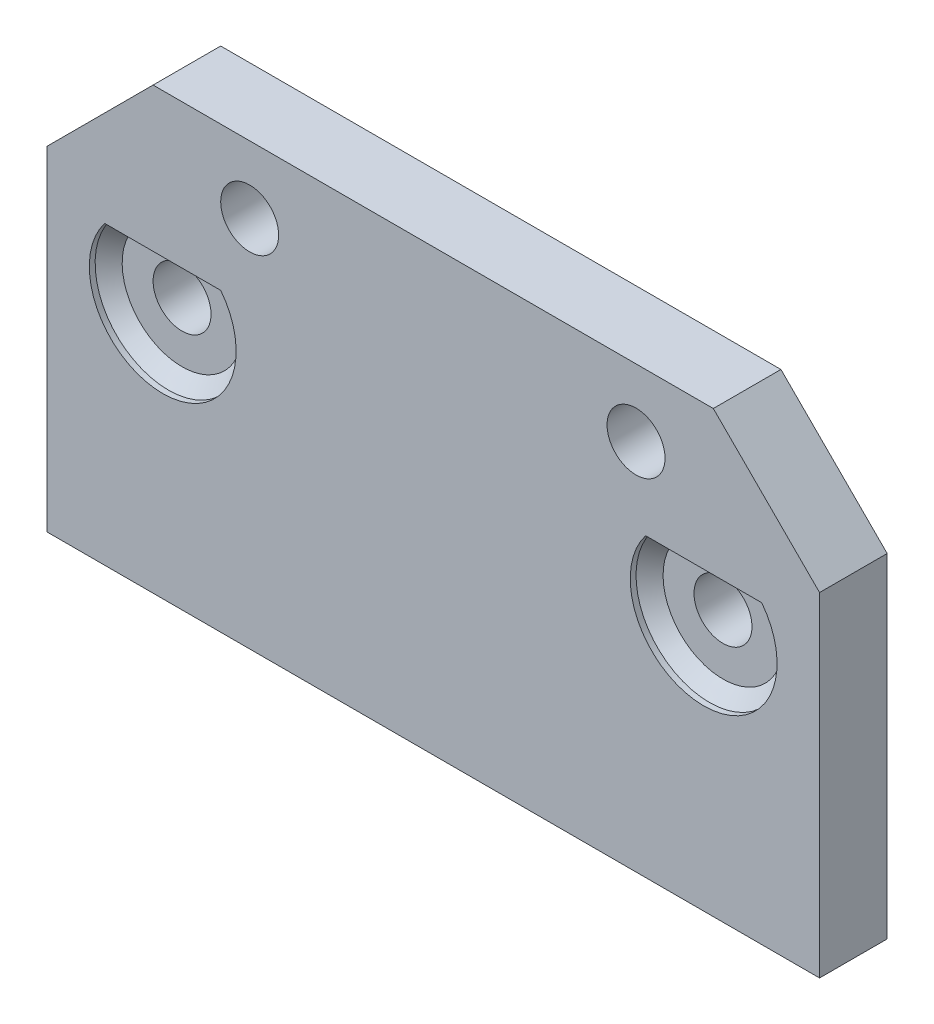
ISO-10303-21;
HEADER;
FILE_DESCRIPTION(('STEP AP214'),'2;1');
FILE_NAME('part.step','',(''),(''),'','','');
FILE_SCHEMA(('AUTOMOTIVE_DESIGN { 1 0 10303 214 1 1 1 1 }'));
ENDSEC;
DATA;
#1=APPLICATION_CONTEXT('core data for automotive mechanical design processes');
#2=APPLICATION_PROTOCOL_DEFINITION('international standard','automotive_design',2000,#1);
#3=PRODUCT_CONTEXT('',#1,'mechanical');
#4=PRODUCT('Part','Part','',(#3));
#5=PRODUCT_RELATED_PRODUCT_CATEGORY('part','',(#4));
#6=PRODUCT_DEFINITION_FORMATION('','',#4);
#7=PRODUCT_DEFINITION_CONTEXT('part definition',#1,'design');
#8=PRODUCT_DEFINITION('design','',#6,#7);
#9=PRODUCT_DEFINITION_SHAPE('','',#8);
#10=(LENGTH_UNIT() NAMED_UNIT(*) SI_UNIT(.MILLI.,.METRE.));
#11=(NAMED_UNIT(*) PLANE_ANGLE_UNIT() SI_UNIT($,.RADIAN.));
#12=(NAMED_UNIT(*) SI_UNIT($,.STERADIAN.) SOLID_ANGLE_UNIT());
#13=UNCERTAINTY_MEASURE_WITH_UNIT(LENGTH_MEASURE(1.E-05),#10,'distance_accuracy_value','');
#14=(GEOMETRIC_REPRESENTATION_CONTEXT(3) GLOBAL_UNCERTAINTY_ASSIGNED_CONTEXT((#13)) GLOBAL_UNIT_ASSIGNED_CONTEXT((#10,
#11,#12)) REPRESENTATION_CONTEXT('',''));
#15=CARTESIAN_POINT('',(0.,0.,0.));
#16=DIRECTION('',(0.,0.,1.));
#17=DIRECTION('',(1.,0.,0.));
#18=AXIS2_PLACEMENT_3D('',#15,#16,#17);
#19=CARTESIAN_POINT('',(21.1621621621622,3.,-2.5));
#20=DIRECTION('',(0.,0.,1.));
#21=DIRECTION('',(1.,0.,0.));
#22=AXIS2_PLACEMENT_3D('',#19,#20,#21);
#23=CYLINDRICAL_SURFACE('',#22,1.5);
#24=CARTESIAN_POINT('',(21.1621621621622,3.,-2.5));
#25=DIRECTION('',(0.,0.,1.));
#26=DIRECTION('',(1.,0.,0.));
#27=AXIS2_PLACEMENT_3D('',#24,#25,#26);
#28=CIRCLE('',#27,1.5);
#29=CARTESIAN_POINT('',(22.6621621621622,3.,-2.5));
#30=VERTEX_POINT('',#29);
#31=EDGE_CURVE('E278',#30,#30,#28,.T.);
#32=ORIENTED_EDGE('',*,*,#31,.F.);
#33=EDGE_LOOP('',(#32));
#34=FACE_BOUND('',#33,.T.);
#35=CARTESIAN_POINT('',(21.1621621621622,3.,0.));
#36=DIRECTION('',(0.,0.,1.));
#37=DIRECTION('',(1.,0.,0.));
#38=AXIS2_PLACEMENT_3D('',#35,#36,#37);
#39=CIRCLE('',#38,1.5);
#40=CARTESIAN_POINT('',(22.6621621621622,3.,0.));
#41=VERTEX_POINT('',#40);
#42=EDGE_CURVE('E264',#41,#41,#39,.F.);
#43=ORIENTED_EDGE('',*,*,#42,.F.);
#44=EDGE_LOOP('',(#43));
#45=FACE_BOUND('',#44,.T.);
#46=ADVANCED_FACE('F37',(#34,#45),#23,.F.);
#47=CARTESIAN_POINT('',(-6.83783783783783,3.,-2.5));
#48=DIRECTION('',(0.,0.,1.));
#49=DIRECTION('',(1.,0.,0.));
#50=AXIS2_PLACEMENT_3D('',#47,#48,#49);
#51=CYLINDRICAL_SURFACE('',#50,1.5);
#52=CARTESIAN_POINT('',(-6.83783783783783,3.,-2.5));
#53=DIRECTION('',(0.,0.,1.));
#54=DIRECTION('',(1.,0.,0.));
#55=AXIS2_PLACEMENT_3D('',#52,#53,#54);
#56=CIRCLE('',#55,1.5);
#57=CARTESIAN_POINT('',(-5.33783783783783,3.,-2.5));
#58=VERTEX_POINT('',#57);
#59=EDGE_CURVE('E286',#58,#58,#56,.T.);
#60=ORIENTED_EDGE('',*,*,#59,.F.);
#61=EDGE_LOOP('',(#60));
#62=FACE_BOUND('',#61,.T.);
#63=CARTESIAN_POINT('',(-6.83783783783783,3.,0.));
#64=DIRECTION('',(0.,0.,1.));
#65=DIRECTION('',(1.,0.,0.));
#66=AXIS2_PLACEMENT_3D('',#63,#64,#65);
#67=CIRCLE('',#66,1.5);
#68=CARTESIAN_POINT('',(-5.33783783783783,3.,0.));
#69=VERTEX_POINT('',#68);
#70=EDGE_CURVE('E268',#69,#69,#67,.F.);
#71=ORIENTED_EDGE('',*,*,#70,.F.);
#72=EDGE_LOOP('',(#71));
#73=FACE_BOUND('',#72,.T.);
#74=ADVANCED_FACE('F354',(#62,#73),#51,.F.);
#75=CARTESIAN_POINT('',(-12.8378378378378,18.5,-2.5));
#76=DIRECTION('',(1.,0.,0.));
#77=DIRECTION('',(0.,0.,-1.));
#78=AXIS2_PLACEMENT_3D('',#75,#76,#77);
#79=PLANE('',#78);
#80=DIRECTION('',(0.,-1.,0.));
#81=VECTOR('',#80,1.);
#82=CARTESIAN_POINT('',(-12.8378378378378,18.5,-2.5));
#83=LINE('',#82,#81);
#84=CARTESIAN_POINT('',(-12.8378378378378,7.28013422091094,-2.5));
#85=VERTEX_POINT('',#84);
#86=CARTESIAN_POINT('',(-12.8378378378378,-10.,-2.5));
#87=VERTEX_POINT('',#86);
#88=EDGE_CURVE('E284',#85,#87,#83,.T.);
#89=ORIENTED_EDGE('',*,*,#88,.T.);
#90=DIRECTION('',(0.,0.,-1.));
#91=VECTOR('',#90,1.);
#92=CARTESIAN_POINT('',(-12.8378378378378,-10.,1.));
#93=LINE('',#92,#91);
#94=CARTESIAN_POINT('',(-12.8378378378378,-10.,1.));
#95=VERTEX_POINT('',#94);
#96=EDGE_CURVE('E179',#95,#87,#93,.T.);
#97=ORIENTED_EDGE('',*,*,#96,.F.);
#98=DIRECTION('',(0.,-1.,0.));
#99=VECTOR('',#98,1.);
#100=CARTESIAN_POINT('',(-12.8378378378378,12.7801342209109,1.));
#101=LINE('',#100,#99);
#102=CARTESIAN_POINT('',(-12.8378378378378,7.28013422091094,1.));
#103=VERTEX_POINT('',#102);
#104=EDGE_CURVE('E295',#103,#95,#101,.T.);
#105=ORIENTED_EDGE('',*,*,#104,.F.);
#106=DIRECTION('',(0.,0.,1.));
#107=VECTOR('',#106,1.);
#108=CARTESIAN_POINT('',(-12.8378378378378,7.28013422091094,-2.5));
#109=LINE('',#108,#107);
#110=EDGE_CURVE('E324',#85,#103,#109,.T.);
#111=ORIENTED_EDGE('',*,*,#110,.F.);
#112=EDGE_LOOP('',(#89,#97,#105,#111));
#113=FACE_BOUND('',#112,.T.);
#114=ADVANCED_FACE('F360',(#113),#79,.F.);
#115=CARTESIAN_POINT('',(27.1621621621622,18.5,-2.5));
#116=DIRECTION('',(-1.,0.,0.));
#117=DIRECTION('',(0.,0.,1.));
#118=AXIS2_PLACEMENT_3D('',#115,#116,#117);
#119=PLANE('',#118);
#120=DIRECTION('',(0.,0.,1.));
#121=VECTOR('',#120,1.);
#122=CARTESIAN_POINT('',(27.1621621621622,7.28013422091094,-2.5));
#123=LINE('',#122,#121);
#124=CARTESIAN_POINT('',(27.1621621621622,7.28013422091094,-2.5));
#125=VERTEX_POINT('',#124);
#126=CARTESIAN_POINT('',(27.1621621621622,7.28013422091094,1.));
#127=VERTEX_POINT('',#126);
#128=EDGE_CURVE('E313',#125,#127,#123,.T.);
#129=ORIENTED_EDGE('',*,*,#128,.T.);
#130=DIRECTION('',(0.,1.,0.));
#131=VECTOR('',#130,1.);
#132=CARTESIAN_POINT('',(27.1621621621622,12.7801342209109,1.));
#133=LINE('',#132,#131);
#134=CARTESIAN_POINT('',(27.1621621621622,-10.,1.));
#135=VERTEX_POINT('',#134);
#136=EDGE_CURVE('E293',#135,#127,#133,.T.);
#137=ORIENTED_EDGE('',*,*,#136,.F.);
#138=DIRECTION('',(0.,0.,1.));
#139=VECTOR('',#138,1.);
#140=CARTESIAN_POINT('',(27.1621621621622,-10.,1.));
#141=LINE('',#140,#139);
#142=CARTESIAN_POINT('',(27.1621621621622,-10.,-2.5));
#143=VERTEX_POINT('',#142);
#144=EDGE_CURVE('E186',#143,#135,#141,.T.);
#145=ORIENTED_EDGE('',*,*,#144,.F.);
#146=DIRECTION('',(0.,-1.,0.));
#147=VECTOR('',#146,1.);
#148=CARTESIAN_POINT('',(27.1621621621622,18.5,-2.5));
#149=LINE('',#148,#147);
#150=EDGE_CURVE('E274',#125,#143,#149,.T.);
#151=ORIENTED_EDGE('',*,*,#150,.F.);
#152=EDGE_LOOP('',(#129,#137,#145,#151));
#153=FACE_BOUND('',#152,.T.);
#154=ADVANCED_FACE('F370',(#153),#119,.F.);
#155=CARTESIAN_POINT('',(-12.8378378378378,18.5,-2.5));
#156=DIRECTION('',(0.,0.,1.));
#157=DIRECTION('',(1.,0.,0.));
#158=AXIS2_PLACEMENT_3D('',#155,#156,#157);
#159=PLANE('',#158);
#160=DIRECTION('',(0.,-1.,0.));
#161=VECTOR('',#160,1.);
#162=CARTESIAN_POINT('',(13.6621621621622,12.7801342209109,-2.5));
#163=LINE('',#162,#161);
#164=CARTESIAN_POINT('',(13.6621621621622,11.235134390256,-2.5));
#165=VERTEX_POINT('',#164);
#166=CARTESIAN_POINT('',(13.6621621621622,-0.62890017525415,-2.5));
#167=VERTEX_POINT('',#166);
#168=EDGE_CURVE('E307',#165,#167,#163,.T.);
#169=ORIENTED_EDGE('',*,*,#168,.F.);
#170=DIRECTION('',(-1.,0.,0.));
#171=VECTOR('',#170,1.);
#172=CARTESIAN_POINT('',(13.6621621621622,11.235134390256,-2.5));
#173=LINE('',#172,#171);
#174=CARTESIAN_POINT('',(1.66216216216217,11.235134390256,-2.5));
#175=VERTEX_POINT('',#174);
#176=EDGE_CURVE('E169',#165,#175,#173,.T.);
#177=ORIENTED_EDGE('',*,*,#176,.T.);
#178=DIRECTION('',(0.,1.,0.));
#179=VECTOR('',#178,1.);
#180=CARTESIAN_POINT('',(1.66216216216217,12.7801342209109,-2.5));
#181=LINE('',#180,#179);
#182=CARTESIAN_POINT('',(1.66216216216217,-0.62890017525415,-2.5));
#183=VERTEX_POINT('',#182);
#184=EDGE_CURVE('E62',#183,#175,#181,.T.);
#185=ORIENTED_EDGE('',*,*,#184,.F.);
#186=DIRECTION('',(1.,0.,0.));
#187=VECTOR('',#186,1.);
#188=CARTESIAN_POINT('',(13.6621621621622,-0.62890017525415,-2.5));
#189=LINE('',#188,#187);
#190=EDGE_CURVE('E166',#183,#167,#189,.T.);
#191=ORIENTED_EDGE('',*,*,#190,.T.);
#192=EDGE_LOOP('',(#169,#177,#185,#191));
#193=FACE_BOUND('',#192,.T.);
#194=DIRECTION('',(0.707106781186548,0.707106781186548,0.));
#195=VECTOR('',#194,1.);
#196=CARTESIAN_POINT('',(-12.8378378378378,7.28013422091094,-2.5));
#197=LINE('',#196,#195);
#198=CARTESIAN_POINT('',(-7.33783783783784,12.7801342209109,-2.5));
#199=VERTEX_POINT('',#198);
#200=EDGE_CURVE('E326',#85,#199,#197,.T.);
#201=ORIENTED_EDGE('',*,*,#200,.T.);
#202=DIRECTION('',(1.,0.,0.));
#203=VECTOR('',#202,1.);
#204=CARTESIAN_POINT('',(-12.8378378378378,12.7801342209109,-2.5));
#205=LINE('',#204,#203);
#206=CARTESIAN_POINT('',(21.6621621621622,12.7801342209109,-2.5));
#207=VERTEX_POINT('',#206);
#208=EDGE_CURVE('E263',#199,#207,#205,.T.);
#209=ORIENTED_EDGE('',*,*,#208,.T.);
#210=DIRECTION('',(0.707106781186548,-0.707106781186547,0.));
#211=VECTOR('',#210,1.);
#212=CARTESIAN_POINT('',(21.6621621621622,12.7801342209109,-2.5));
#213=LINE('',#212,#211);
#214=EDGE_CURVE('E314',#207,#125,#213,.T.);
#215=ORIENTED_EDGE('',*,*,#214,.T.);
#216=ORIENTED_EDGE('',*,*,#150,.T.);
#217=DIRECTION('',(1.,0.,0.));
#218=VECTOR('',#217,1.);
#219=CARTESIAN_POINT('',(-12.8378378378378,-10.,-2.5));
#220=LINE('',#219,#218);
#221=EDGE_CURVE('E183',#87,#143,#220,.T.);
#222=ORIENTED_EDGE('',*,*,#221,.F.);
#223=ORIENTED_EDGE('',*,*,#88,.F.);
#224=EDGE_LOOP('',(#201,#209,#215,#216,#222,#223));
#225=FACE_BOUND('',#224,.T.);
#226=CARTESIAN_POINT('',(-2.33783783783782,9.3,-2.5));
#227=DIRECTION('',(0.,0.,1.));
#228=DIRECTION('',(1.,0.,0.));
#229=AXIS2_PLACEMENT_3D('',#226,#227,#228);
#230=CIRCLE('',#229,1.5);
#231=CARTESIAN_POINT('',(-0.837837837837824,9.3,-2.5));
#232=VERTEX_POINT('',#231);
#233=EDGE_CURVE('E275',#232,#232,#230,.T.);
#234=ORIENTED_EDGE('',*,*,#233,.T.);
#235=EDGE_LOOP('',(#234));
#236=FACE_BOUND('',#235,.T.);
#237=ORIENTED_EDGE('',*,*,#59,.T.);
#238=EDGE_LOOP('',(#237));
#239=FACE_BOUND('',#238,.T.);
#240=ORIENTED_EDGE('',*,*,#31,.T.);
#241=EDGE_LOOP('',(#240));
#242=FACE_BOUND('',#241,.T.);
#243=CARTESIAN_POINT('',(17.6621621621622,9.3,-2.5));
#244=DIRECTION('',(0.,0.,1.));
#245=DIRECTION('',(1.,0.,0.));
#246=AXIS2_PLACEMENT_3D('',#243,#244,#245);
#247=CIRCLE('',#246,1.5);
#248=CARTESIAN_POINT('',(19.1621621621622,9.3,-2.5));
#249=VERTEX_POINT('',#248);
#250=EDGE_CURVE('E279',#249,#249,#247,.T.);
#251=ORIENTED_EDGE('',*,*,#250,.T.);
#252=EDGE_LOOP('',(#251));
#253=FACE_BOUND('',#252,.T.);
#254=ADVANCED_FACE('F366',(#193,#225,#236,#239,#242,#253),#159,.F.);
#255=CARTESIAN_POINT('',(17.6621621621622,9.3,-40.));
#256=DIRECTION('',(0.,0.,1.));
#257=DIRECTION('',(1.,0.,0.));
#258=AXIS2_PLACEMENT_3D('',#255,#256,#257);
#259=CYLINDRICAL_SURFACE('',#258,1.5);
#260=ORIENTED_EDGE('',*,*,#250,.F.);
#261=EDGE_LOOP('',(#260));
#262=FACE_BOUND('',#261,.T.);
#263=CARTESIAN_POINT('',(17.6621621621622,9.3,1.));
#264=DIRECTION('',(0.,0.,-1.));
#265=DIRECTION('',(-1.,0.,0.));
#266=AXIS2_PLACEMENT_3D('',#263,#264,#265);
#267=CIRCLE('',#266,1.5);
#268=CARTESIAN_POINT('',(16.1621621621622,9.3,1.));
#269=VERTEX_POINT('',#268);
#270=EDGE_CURVE('E297',#269,#269,#267,.T.);
#271=ORIENTED_EDGE('',*,*,#270,.F.);
#272=EDGE_LOOP('',(#271));
#273=FACE_BOUND('',#272,.T.);
#274=ADVANCED_FACE('F369',(#262,#273),#259,.F.);
#275=CARTESIAN_POINT('',(-2.33783783783782,9.3,-40.));
#276=DIRECTION('',(0.,0.,1.));
#277=DIRECTION('',(1.,0.,0.));
#278=AXIS2_PLACEMENT_3D('',#275,#276,#277);
#279=CYLINDRICAL_SURFACE('',#278,1.5);
#280=ORIENTED_EDGE('',*,*,#233,.F.);
#281=EDGE_LOOP('',(#280));
#282=FACE_BOUND('',#281,.T.);
#283=CARTESIAN_POINT('',(-2.33783783783782,9.3,1.));
#284=DIRECTION('',(0.,0.,-1.));
#285=DIRECTION('',(-1.,0.,0.));
#286=AXIS2_PLACEMENT_3D('',#283,#284,#285);
#287=CIRCLE('',#286,1.5);
#288=CARTESIAN_POINT('',(-3.83783783783782,9.3,1.));
#289=VERTEX_POINT('',#288);
#290=EDGE_CURVE('E267',#289,#289,#287,.T.);
#291=ORIENTED_EDGE('',*,*,#290,.F.);
#292=EDGE_LOOP('',(#291));
#293=FACE_BOUND('',#292,.T.);
#294=ADVANCED_FACE('F426',(#282,#293),#279,.F.);
#295=CARTESIAN_POINT('',(-12.8378378378378,12.7801342209109,-40.));
#296=DIRECTION('',(0.,-1.,0.));
#297=DIRECTION('',(0.,0.,-1.));
#298=AXIS2_PLACEMENT_3D('',#295,#296,#297);
#299=PLANE('',#298);
#300=ORIENTED_EDGE('',*,*,#208,.F.);
#301=DIRECTION('',(0.,0.,1.));
#302=VECTOR('',#301,1.);
#303=CARTESIAN_POINT('',(-7.33783783783784,12.7801342209109,-2.5));
#304=LINE('',#303,#302);
#305=CARTESIAN_POINT('',(-7.33783783783784,12.7801342209109,1.));
#306=VERTEX_POINT('',#305);
#307=EDGE_CURVE('E308',#199,#306,#304,.T.);
#308=ORIENTED_EDGE('',*,*,#307,.T.);
#309=DIRECTION('',(-1.,0.,0.));
#310=VECTOR('',#309,1.);
#311=CARTESIAN_POINT('',(-12.8378378378378,12.7801342209109,1.));
#312=LINE('',#311,#310);
#313=CARTESIAN_POINT('',(21.6621621621622,12.7801342209109,1.));
#314=VERTEX_POINT('',#313);
#315=EDGE_CURVE('E282',#314,#306,#312,.T.);
#316=ORIENTED_EDGE('',*,*,#315,.F.);
#317=DIRECTION('',(0.,0.,1.));
#318=VECTOR('',#317,1.);
#319=CARTESIAN_POINT('',(21.6621621621622,12.7801342209109,-2.5));
#320=LINE('',#319,#318);
#321=EDGE_CURVE('E311',#207,#314,#320,.T.);
#322=ORIENTED_EDGE('',*,*,#321,.F.);
#323=EDGE_LOOP('',(#300,#308,#316,#322));
#324=FACE_BOUND('',#323,.T.);
#325=ADVANCED_FACE('F396',(#324),#299,.F.);
#326=CARTESIAN_POINT('',(0.,0.,1.));
#327=DIRECTION('',(0.,0.,1.));
#328=DIRECTION('',(1.,0.,0.));
#329=AXIS2_PLACEMENT_3D('',#326,#327,#328);
#330=PLANE('',#329);
#331=CARTESIAN_POINT('',(-6.83783783783783,3.,1.));
#332=DIRECTION('',(0.,0.,1.));
#333=DIRECTION('',(1.,0.,0.));
#334=AXIS2_PLACEMENT_3D('',#331,#332,#333);
#335=CIRCLE('',#334,3.8);
#336=CARTESIAN_POINT('',(-9.84260218547782,5.32623971575407,1.));
#337=VERTEX_POINT('',#336);
#338=CARTESIAN_POINT('',(-3.83307349019783,5.32623971575407,1.));
#339=VERTEX_POINT('',#338);
#340=EDGE_CURVE('E271',#337,#339,#335,.T.);
#341=ORIENTED_EDGE('',*,*,#340,.F.);
#342=DIRECTION('',(1.,0.,0.));
#343=VECTOR('',#342,1.);
#344=CARTESIAN_POINT('',(-12.8378378378378,5.32623971575407,1.));
#345=LINE('',#344,#343);
#346=EDGE_CURVE('E195',#337,#339,#345,.T.);
#347=ORIENTED_EDGE('',*,*,#346,.T.);
#348=EDGE_LOOP('',(#341,#347));
#349=FACE_BOUND('',#348,.T.);
#350=CARTESIAN_POINT('',(21.1621621621622,3.,1.));
#351=DIRECTION('',(0.,0.,1.));
#352=DIRECTION('',(1.,0.,0.));
#353=AXIS2_PLACEMENT_3D('',#350,#351,#352);
#354=CIRCLE('',#353,3.8);
#355=CARTESIAN_POINT('',(18.1573978145222,5.32623971575407,1.));
#356=VERTEX_POINT('',#355);
#357=CARTESIAN_POINT('',(24.1669265098022,5.32623971575407,1.));
#358=VERTEX_POINT('',#357);
#359=EDGE_CURVE('E158',#356,#358,#354,.T.);
#360=ORIENTED_EDGE('',*,*,#359,.F.);
#361=EDGE_CURVE('E192',#356,#358,#345,.T.);
#362=ORIENTED_EDGE('',*,*,#361,.T.);
#363=EDGE_LOOP('',(#360,#362));
#364=FACE_BOUND('',#363,.T.);
#365=ORIENTED_EDGE('',*,*,#104,.T.);
#366=DIRECTION('',(-1.,0.,0.));
#367=VECTOR('',#366,1.);
#368=CARTESIAN_POINT('',(-12.8378378378378,-10.,1.));
#369=LINE('',#368,#367);
#370=EDGE_CURVE('E189',#135,#95,#369,.T.);
#371=ORIENTED_EDGE('',*,*,#370,.F.);
#372=ORIENTED_EDGE('',*,*,#136,.T.);
#373=DIRECTION('',(0.707106781186548,-0.707106781186547,0.));
#374=VECTOR('',#373,1.);
#375=CARTESIAN_POINT('',(21.6621621621622,12.7801342209109,1.));
#376=LINE('',#375,#374);
#377=EDGE_CURVE('E318',#314,#127,#376,.T.);
#378=ORIENTED_EDGE('',*,*,#377,.F.);
#379=ORIENTED_EDGE('',*,*,#315,.T.);
#380=DIRECTION('',(0.707106781186548,0.707106781186548,0.));
#381=VECTOR('',#380,1.);
#382=CARTESIAN_POINT('',(-12.8378378378378,7.28013422091094,1.));
#383=LINE('',#382,#381);
#384=EDGE_CURVE('E317',#103,#306,#383,.T.);
#385=ORIENTED_EDGE('',*,*,#384,.F.);
#386=EDGE_LOOP('',(#365,#371,#372,#378,#379,#385));
#387=FACE_BOUND('',#386,.T.);
#388=ORIENTED_EDGE('',*,*,#290,.T.);
#389=EDGE_LOOP('',(#388));
#390=FACE_BOUND('',#389,.T.);
#391=ORIENTED_EDGE('',*,*,#270,.T.);
#392=EDGE_LOOP('',(#391));
#393=FACE_BOUND('',#392,.T.);
#394=ADVANCED_FACE('F342',(#349,#364,#387,#390,#393),#330,.T.);
#395=CARTESIAN_POINT('',(21.1621621621622,3.,0.));
#396=DIRECTION('',(0.,0.,1.));
#397=DIRECTION('',(1.,0.,0.));
#398=AXIS2_PLACEMENT_3D('',#395,#396,#397);
#399=PLANE('',#398);
#400=DIRECTION('',(1.,0.,0.));
#401=VECTOR('',#400,1.);
#402=CARTESIAN_POINT('',(21.1621621621622,5.32623971575407,0.));
#403=LINE('',#402,#401);
#404=CARTESIAN_POINT('',(19.1131114588246,5.32623971575407,0.));
#405=VERTEX_POINT('',#404);
#406=CARTESIAN_POINT('',(23.2112128654998,5.32623971575407,0.));
#407=VERTEX_POINT('',#406);
#408=EDGE_CURVE('E333',#405,#407,#403,.T.);
#409=ORIENTED_EDGE('',*,*,#408,.F.);
#410=CARTESIAN_POINT('',(21.1621621621622,3.,0.));
#411=DIRECTION('',(0.,0.,1.));
#412=DIRECTION('',(1.,0.,0.));
#413=AXIS2_PLACEMENT_3D('',#410,#411,#412);
#414=CIRCLE('',#413,3.09999999999999);
#415=EDGE_CURVE('E258',#405,#407,#414,.T.);
#416=ORIENTED_EDGE('',*,*,#415,.T.);
#417=EDGE_LOOP('',(#409,#416));
#418=FACE_BOUND('',#417,.T.);
#419=ORIENTED_EDGE('',*,*,#42,.T.);
#420=EDGE_LOOP('',(#419));
#421=FACE_BOUND('',#420,.T.);
#422=ADVANCED_FACE('F347',(#418,#421),#399,.T.);
#423=CARTESIAN_POINT('',(21.1621621621622,3.,0.));
#424=DIRECTION('',(0.,0.,1.));
#425=DIRECTION('',(1.,0.,0.));
#426=AXIS2_PLACEMENT_3D('',#423,#424,#425);
#427=CYLINDRICAL_SURFACE('',#426,3.8);
#428=ORIENTED_EDGE('',*,*,#359,.T.);
#429=DIRECTION('',(0.,0.,1.));
#430=VECTOR('',#429,1.);
#431=CARTESIAN_POINT('',(24.1669265098022,5.32623971575407,0.));
#432=LINE('',#431,#430);
#433=CARTESIAN_POINT('',(24.1669265098023,5.32623971575407,0.700000000000061));
#434=VERTEX_POINT('',#433);
#435=EDGE_CURVE('E321',#358,#434,#432,.F.);
#436=ORIENTED_EDGE('',*,*,#435,.T.);
#437=CARTESIAN_POINT('',(21.1621621621622,3.,0.699999999999999));
#438=DIRECTION('',(0.,0.,1.));
#439=DIRECTION('',(1.,0.,0.));
#440=AXIS2_PLACEMENT_3D('',#437,#438,#439);
#441=CIRCLE('',#440,3.8);
#442=CARTESIAN_POINT('',(18.1573978145222,5.32623971575407,0.699999999999999));
#443=VERTEX_POINT('',#442);
#444=EDGE_CURVE('E256',#434,#443,#441,.F.);
#445=ORIENTED_EDGE('',*,*,#444,.T.);
#446=DIRECTION('',(0.,0.,1.));
#447=VECTOR('',#446,1.);
#448=CARTESIAN_POINT('',(18.1573978145222,5.32623971575407,0.));
#449=LINE('',#448,#447);
#450=EDGE_CURVE('E212',#443,#356,#449,.T.);
#451=ORIENTED_EDGE('',*,*,#450,.T.);
#452=EDGE_LOOP('',(#428,#436,#445,#451));
#453=FACE_BOUND('',#452,.T.);
#454=ADVANCED_FACE('F339',(#453),#427,.F.);
#455=CARTESIAN_POINT('',(-6.83783783783783,3.,0.));
#456=DIRECTION('',(0.,0.,1.));
#457=DIRECTION('',(1.,0.,0.));
#458=AXIS2_PLACEMENT_3D('',#455,#456,#457);
#459=PLANE('',#458);
#460=DIRECTION('',(1.,0.,0.));
#461=VECTOR('',#460,1.);
#462=CARTESIAN_POINT('',(-6.83783783783783,5.32623971575407,0.));
#463=LINE('',#462,#461);
#464=CARTESIAN_POINT('',(-8.88688854117545,5.32623971575407,0.));
#465=VERTEX_POINT('',#464);
#466=CARTESIAN_POINT('',(-4.78878713450021,5.32623971575407,0.));
#467=VERTEX_POINT('',#466);
#468=EDGE_CURVE('E199',#465,#467,#463,.T.);
#469=ORIENTED_EDGE('',*,*,#468,.F.);
#470=CARTESIAN_POINT('',(-6.83783783783783,3.,0.));
#471=DIRECTION('',(0.,0.,1.));
#472=DIRECTION('',(1.,0.,0.));
#473=AXIS2_PLACEMENT_3D('',#470,#471,#472);
#474=CIRCLE('',#473,3.1);
#475=EDGE_CURVE('E249',#465,#467,#474,.T.);
#476=ORIENTED_EDGE('',*,*,#475,.T.);
#477=EDGE_LOOP('',(#469,#476));
#478=FACE_BOUND('',#477,.T.);
#479=ORIENTED_EDGE('',*,*,#70,.T.);
#480=EDGE_LOOP('',(#479));
#481=FACE_BOUND('',#480,.T.);
#482=ADVANCED_FACE('F254',(#478,#481),#459,.T.);
#483=CARTESIAN_POINT('',(-6.83783783783783,3.,0.));
#484=DIRECTION('',(0.,0.,1.));
#485=DIRECTION('',(1.,0.,0.));
#486=AXIS2_PLACEMENT_3D('',#483,#484,#485);
#487=CYLINDRICAL_SURFACE('',#486,3.8);
#488=ORIENTED_EDGE('',*,*,#340,.T.);
#489=DIRECTION('',(0.,0.,1.));
#490=VECTOR('',#489,1.);
#491=CARTESIAN_POINT('',(-3.83307349019783,5.32623971575407,0.));
#492=LINE('',#491,#490);
#493=CARTESIAN_POINT('',(-3.83307349019767,5.32623971575407,0.70000000000006));
#494=VERTEX_POINT('',#493);
#495=EDGE_CURVE('E201',#339,#494,#492,.F.);
#496=ORIENTED_EDGE('',*,*,#495,.T.);
#497=CARTESIAN_POINT('',(-6.83783783783783,3.,0.699999999999997));
#498=DIRECTION('',(0.,0.,1.));
#499=DIRECTION('',(1.,0.,0.));
#500=AXIS2_PLACEMENT_3D('',#497,#498,#499);
#501=CIRCLE('',#500,3.8);
#502=CARTESIAN_POINT('',(-9.84260218547782,5.32623971575407,0.699999999999997));
#503=VERTEX_POINT('',#502);
#504=EDGE_CURVE('E240',#494,#503,#501,.F.);
#505=ORIENTED_EDGE('',*,*,#504,.T.);
#506=DIRECTION('',(0.,0.,1.));
#507=VECTOR('',#506,1.);
#508=CARTESIAN_POINT('',(-9.84260218547782,5.32623971575407,0.));
#509=LINE('',#508,#507);
#510=EDGE_CURVE('E196',#503,#337,#509,.T.);
#511=ORIENTED_EDGE('',*,*,#510,.T.);
#512=EDGE_LOOP('',(#488,#496,#505,#511));
#513=FACE_BOUND('',#512,.T.);
#514=ADVANCED_FACE('F413',(#513),#487,.F.);
#515=CARTESIAN_POINT('',(13.6621621621622,12.7801342209109,-1.));
#516=DIRECTION('',(1.,0.,0.));
#517=DIRECTION('',(0.,1.,0.));
#518=AXIS2_PLACEMENT_3D('',#515,#516,#517);
#519=PLANE('',#518);
#520=DIRECTION('',(0.,-1.,0.));
#521=VECTOR('',#520,1.);
#522=CARTESIAN_POINT('',(13.6621621621622,12.7801342209109,-1.));
#523=LINE('',#522,#521);
#524=CARTESIAN_POINT('',(13.6621621621622,11.235134390256,-1.));
#525=VERTEX_POINT('',#524);
#526=CARTESIAN_POINT('',(13.6621621621622,-0.62890017525415,-1.));
#527=VERTEX_POINT('',#526);
#528=EDGE_CURVE('E159',#525,#527,#523,.T.);
#529=ORIENTED_EDGE('',*,*,#528,.F.);
#530=DIRECTION('',(0.,0.,-1.));
#531=VECTOR('',#530,1.);
#532=CARTESIAN_POINT('',(13.6621621621622,11.235134390256,-0.5));
#533=LINE('',#532,#531);
#534=EDGE_CURVE('E54',#525,#165,#533,.T.);
#535=ORIENTED_EDGE('',*,*,#534,.T.);
#536=ORIENTED_EDGE('',*,*,#168,.T.);
#537=DIRECTION('',(0.,0.,-1.));
#538=VECTOR('',#537,1.);
#539=CARTESIAN_POINT('',(13.6621621621622,-0.62890017525415,-0.5));
#540=LINE('',#539,#538);
#541=EDGE_CURVE('E176',#527,#167,#540,.T.);
#542=ORIENTED_EDGE('',*,*,#541,.F.);
#543=EDGE_LOOP('',(#529,#535,#536,#542));
#544=FACE_BOUND('',#543,.T.);
#545=ADVANCED_FACE('F410',(#544),#519,.F.);
#546=CARTESIAN_POINT('',(1.66216216216217,12.7801342209109,-1.));
#547=DIRECTION('',(-1.,0.,0.));
#548=DIRECTION('',(0.,-1.,0.));
#549=AXIS2_PLACEMENT_3D('',#546,#547,#548);
#550=PLANE('',#549);
#551=ORIENTED_EDGE('',*,*,#184,.T.);
#552=DIRECTION('',(0.,0.,-1.));
#553=VECTOR('',#552,1.);
#554=CARTESIAN_POINT('',(1.66216216216217,11.235134390256,-0.5));
#555=LINE('',#554,#553);
#556=CARTESIAN_POINT('',(1.66216216216217,11.235134390256,-1.));
#557=VERTEX_POINT('',#556);
#558=EDGE_CURVE('E161',#557,#175,#555,.T.);
#559=ORIENTED_EDGE('',*,*,#558,.F.);
#560=DIRECTION('',(0.,1.,0.));
#561=VECTOR('',#560,1.);
#562=CARTESIAN_POINT('',(1.66216216216217,12.7801342209109,-1.));
#563=LINE('',#562,#561);
#564=CARTESIAN_POINT('',(1.66216216216217,-0.62890017525415,-1.));
#565=VERTEX_POINT('',#564);
#566=EDGE_CURVE('E155',#565,#557,#563,.T.);
#567=ORIENTED_EDGE('',*,*,#566,.F.);
#568=DIRECTION('',(0.,0.,-1.));
#569=VECTOR('',#568,1.);
#570=CARTESIAN_POINT('',(1.66216216216217,-0.62890017525415,-0.5));
#571=LINE('',#570,#569);
#572=EDGE_CURVE('E175',#565,#183,#571,.T.);
#573=ORIENTED_EDGE('',*,*,#572,.T.);
#574=EDGE_LOOP('',(#551,#559,#567,#573));
#575=FACE_BOUND('',#574,.T.);
#576=ADVANCED_FACE('F162',(#575),#550,.F.);
#577=CARTESIAN_POINT('',(0.,0.,-1.));
#578=DIRECTION('',(0.,0.,-1.));
#579=DIRECTION('',(-1.,0.,0.));
#580=AXIS2_PLACEMENT_3D('',#577,#578,#579);
#581=PLANE('',#580);
#582=DIRECTION('',(-1.,0.,0.));
#583=VECTOR('',#582,1.);
#584=CARTESIAN_POINT('',(0.,11.235134390256,-1.));
#585=LINE('',#584,#583);
#586=EDGE_CURVE('E11',#525,#557,#585,.T.);
#587=ORIENTED_EDGE('',*,*,#586,.F.);
#588=ORIENTED_EDGE('',*,*,#528,.T.);
#589=DIRECTION('',(1.,0.,0.));
#590=VECTOR('',#589,1.);
#591=CARTESIAN_POINT('',(0.,-0.62890017525415,-1.));
#592=LINE('',#591,#590);
#593=EDGE_CURVE('E47',#565,#527,#592,.T.);
#594=ORIENTED_EDGE('',*,*,#593,.F.);
#595=ORIENTED_EDGE('',*,*,#566,.T.);
#596=EDGE_LOOP('',(#587,#588,#594,#595));
#597=FACE_BOUND('',#596,.T.);
#598=ADVANCED_FACE('F156',(#597),#581,.T.);
#599=CARTESIAN_POINT('',(21.1621621621622,3.,0.));
#600=DIRECTION('',(0.,0.,1.));
#601=DIRECTION('',(1.,0.,0.));
#602=AXIS2_PLACEMENT_3D('',#599,#600,#601);
#603=CONICAL_SURFACE('',#602,3.09999999999999,0.785398163397455);
#604=ORIENTED_EDGE('',*,*,#444,.F.);
#605=CARTESIAN_POINT('',(29.2122957074266,5.32623971575407,5.27950125674213));
#606=CARTESIAN_POINT('',(29.0528258520584,5.32623971575407,5.12630612933356));
#607=CARTESIAN_POINT('',(28.8931867588744,5.32623971575407,4.97328668584302));
#608=CARTESIAN_POINT('',(28.5734887425241,5.32623971575407,4.66768437118387));
#609=CARTESIAN_POINT('',(28.4134298158272,5.32623971575407,4.51510150370929));
#610=CARTESIAN_POINT('',(28.0927658847737,5.32623971575407,4.21041492276853));
#611=CARTESIAN_POINT('',(27.9321607324356,5.32623971575407,4.05831136496306));
#612=CARTESIAN_POINT('',(27.6103434905621,5.32623971575407,3.7547484256119));
#613=CARTESIAN_POINT('',(27.4491314030823,5.32623971575407,3.60328904188804));
#614=CARTESIAN_POINT('',(27.12764293451,5.32623971575407,3.30274376227121));
#615=CARTESIAN_POINT('',(26.967374306035,5.32623971575407,3.15364957917821));
#616=CARTESIAN_POINT('',(26.6459241869757,5.32623971575407,2.85644880870496));
#617=CARTESIAN_POINT('',(26.4847426999906,5.32623971575407,2.70834221743615));
#618=CARTESIAN_POINT('',(26.1612415632153,5.32623971575407,2.41341686652341));
#619=CARTESIAN_POINT('',(25.9989220589612,5.32623971575407,2.26659794742186));
#620=CARTESIAN_POINT('',(25.6727903973204,5.32623971575407,1.97462945886486));
#621=CARTESIAN_POINT('',(25.5089782679246,5.32623971575407,1.82947985822019));
#622=CARTESIAN_POINT('',(25.2166888766115,5.32623971575407,1.57405031218837));
#623=CARTESIAN_POINT('',(25.0886089258348,5.32623971575407,1.46331629139572));
#624=CARTESIAN_POINT('',(24.8309410679774,5.32623971575407,1.24359214129421));
#625=CARTESIAN_POINT('',(24.7013530455728,5.32623971575407,1.13460214688679));
#626=CARTESIAN_POINT('',(24.4394057491532,5.32623971575407,0.918236360295965));
#627=CARTESIAN_POINT('',(24.3070339148848,5.32623971575407,0.810875727411454));
#628=CARTESIAN_POINT('',(24.0397731345524,5.32623971575407,0.599371511577188));
#629=CARTESIAN_POINT('',(23.9048846946928,5.32623971575407,0.495227292615565));
#630=CARTESIAN_POINT('',(23.6303474943375,5.32623971575407,0.290409724683637));
#631=CARTESIAN_POINT('',(23.4906643677442,5.32623971575407,0.18978218374822));
#632=CARTESIAN_POINT('',(23.2064790525666,5.32623971575407,-0.0048693766018858));
#633=CARTESIAN_POINT('',(23.0619721113475,5.32623971575407,-0.0988865819795737));
#634=CARTESIAN_POINT('',(22.8409759037013,5.32623971575407,-0.231827854400208));
#635=CARTESIAN_POINT('',(22.7668561736669,5.32623971575407,-0.274665915840571));
#636=CARTESIAN_POINT('',(22.6168376539215,5.32623971575407,-0.357093193561428));
#637=CARTESIAN_POINT('',(22.5409385920403,5.32623971575407,-0.396681908591383));
#638=CARTESIAN_POINT('',(22.3104982995828,5.32623971575407,-0.509230977326893));
#639=CARTESIAN_POINT('',(22.1528213320285,5.32623971575407,-0.576220326847212));
#640=CARTESIAN_POINT('',(21.9124402109387,5.32623971575407,-0.656871410441398));
#641=CARTESIAN_POINT('',(21.8329815623558,5.32623971575407,-0.680223043955987));
#642=CARTESIAN_POINT('',(21.67227368289,5.32623971575407,-0.719760008321188));
#643=CARTESIAN_POINT('',(21.5910247451916,5.32623971575407,-0.735946503539024));
#644=CARTESIAN_POINT('',(21.427792352908,5.32623971575407,-0.760024933957243));
#645=CARTESIAN_POINT('',(21.345816434465,5.32623971575407,-0.767967015160173));
#646=CARTESIAN_POINT('',(21.181479821463,5.32623971575407,-0.775128168856454));
#647=CARTESIAN_POINT('',(21.0991191503181,5.32623971575407,-0.774347765417419));
#648=CARTESIAN_POINT('',(20.9350571181924,5.32623971575407,-0.764134160487531));
#649=CARTESIAN_POINT('',(20.8533550347177,5.32623971575407,-0.754712298171752));
#650=CARTESIAN_POINT('',(20.6912741579053,5.32623971575407,-0.727927279370147));
#651=CARTESIAN_POINT('',(20.6108956285746,5.32623971575407,-0.71056255794862));
#652=CARTESIAN_POINT('',(20.4513720979771,5.32623971575407,-0.668820129366538));
#653=CARTESIAN_POINT('',(20.3722407280867,5.32623971575407,-0.644391193763131));
#654=CARTESIAN_POINT('',(20.2160226184222,5.32623971575407,-0.589778304136103));
#655=CARTESIAN_POINT('',(20.1389358312333,5.32623971575407,-0.559594483703442));
#656=CARTESIAN_POINT('',(19.9626396936002,5.32623971575407,-0.484273681776348));
#657=CARTESIAN_POINT('',(19.8641647659053,5.32623971575407,-0.437429831103033));
#658=CARTESIAN_POINT('',(19.6702844137305,5.32623971575407,-0.337722873472681));
#659=CARTESIAN_POINT('',(19.5748809951388,5.32623971575407,-0.284855931382296));
#660=CARTESIAN_POINT('',(19.386512858008,5.32623971575407,-0.174511159367233));
#661=CARTESIAN_POINT('',(19.2935540966538,5.32623971575407,-0.117023242211162));
#662=CARTESIAN_POINT('',(19.1098702859612,5.32623971575407,0.00134910549802756));
#663=CARTESIAN_POINT('',(19.0191447401886,5.32623971575407,0.0622327711816442));
#664=CARTESIAN_POINT('',(18.8385967933426,5.32623971575407,0.187257615913047));
#665=CARTESIAN_POINT('',(18.7487931578877,5.32623971575407,0.251425770807054));
#666=CARTESIAN_POINT('',(18.5707185636767,5.32623971575407,0.381854118817458));
#667=CARTESIAN_POINT('',(18.4824476702578,5.32623971575407,0.448114400778625));
#668=CARTESIAN_POINT('',(18.2197805558995,5.32623971575407,0.649165626260143));
#669=CARTESIAN_POINT('',(18.047267245675,5.32623971575407,0.786412804611691));
#670=CARTESIAN_POINT('',(17.6622993380072,5.32623971575407,1.10061172112359));
#671=CARTESIAN_POINT('',(17.4508482884881,5.32623971575407,1.27878196366544));
#672=CARTESIAN_POINT('',(17.0315859380398,5.32623971575407,1.63937602737062));
#673=CARTESIAN_POINT('',(16.8237750320025,5.32623971575407,1.82180030507891));
#674=CARTESIAN_POINT('',(16.4105187693305,5.32623971575407,2.18967460315134));
#675=CARTESIAN_POINT('',(16.2050757306951,5.32623971575407,2.37512721925754));
#676=CARTESIAN_POINT('',(15.796030352016,5.32623971575407,2.74805253393346));
#677=CARTESIAN_POINT('',(15.5924280362559,5.32623971575407,2.93552525908213));
#678=CARTESIAN_POINT('',(15.1977617645975,5.32623971575407,3.30158876565435));
#679=CARTESIAN_POINT('',(15.0066244309322,5.32623971575407,3.48010055006718));
#680=CARTESIAN_POINT('',(14.6252948650311,5.32623971575407,3.8381356612204));
#681=CARTESIAN_POINT('',(14.4351026470579,5.32623971575407,4.01765900313919));
#682=CARTESIAN_POINT('',(14.0557547791974,5.32623971575407,4.37721582686552));
#683=CARTESIAN_POINT('',(13.8665979871889,5.32623971575407,4.55724810465996));
#684=CARTESIAN_POINT('',(13.4888929741759,5.32623971575407,4.91794047804941));
#685=CARTESIAN_POINT('',(13.3003447378047,5.32623971575407,5.09860055754871));
#686=CARTESIAN_POINT('',(13.1120286168977,5.32623971575407,5.27950125674213));
#687=B_SPLINE_CURVE_WITH_KNOTS('',3,(#605,#606,#607,#608,#609,#610,#611,#612,#613,#614,#615,
#616,#617,#618,#619,#620,#621,#622,#623,#624,#625,#626,#627,#628,#629,#630,#631,#632,#633,#634,
#635,#636,#637,#638,#639,#640,#641,#642,#643,#644,#645,#646,#647,#648,#649,#650,#651,#652,#653,
#654,#655,#656,#657,#658,#659,#660,#661,#662,#663,#664,#665,#666,#667,#668,#669,#670,#671,#672,
#673,#674,#675,#676,#677,#678,#679,#680,#681,#682,#683,#684,#685,#686),.UNSPECIFIED.,.F.,.F.,(4,
2,2,2,2,2,2,2,2,2,2,2,2,2,2,2,2,2,2,2,2,2,2,2,2,2,2,2,2,2,2,2,2,2,2,2,2,2,2,2,4),(0.,
0.663396506964906,1.32679861067328,1.99039761996427,2.65399438363058,3.31067678388976,
3.9673565969843,4.62395390882914,5.28053893295012,5.78846273910325,6.29642564536405,
6.80770071946889,7.31887403847557,7.83522198566828,8.35209461713902,8.60884093702844,
8.86562678895923,9.37781255485515,9.62600823422408,9.87416356585815,10.120800507132,
10.3674226299517,10.6137216016974,10.8600691212245,11.1082499414736,11.3564250012811,
11.6832799145162,12.0103441244035,12.3381427608756,12.6658678587709,12.9969493546658,
13.3280449293072,13.989271519598,14.8187094593669,15.6482368282214,16.4785170292578,
17.3088081678157,18.093405096112,18.8780138287895,19.6614197024019,20.4448056369408),.UNSPECIFIED.);
#688=EDGE_CURVE('E213',#434,#407,#687,.T.);
#689=ORIENTED_EDGE('',*,*,#688,.T.);
#690=ORIENTED_EDGE('',*,*,#415,.F.);
#691=EDGE_CURVE('E204',#405,#443,#687,.T.);
#692=ORIENTED_EDGE('',*,*,#691,.T.);
#693=EDGE_LOOP('',(#604,#689,#690,#692));
#694=FACE_BOUND('',#693,.T.);
#695=ADVANCED_FACE('F216',(#694),#603,.F.);
#696=CARTESIAN_POINT('',(-6.83783783783783,3.,0.));
#697=DIRECTION('',(0.,0.,1.));
#698=DIRECTION('',(1.,0.,0.));
#699=AXIS2_PLACEMENT_3D('',#696,#697,#698);
#700=CONICAL_SURFACE('',#699,3.1,0.785398163397451);
#701=ORIENTED_EDGE('',*,*,#504,.F.);
#702=CARTESIAN_POINT('',(1.2122957074266,5.32623971575407,5.27950125674212));
#703=CARTESIAN_POINT('',(1.05282585205834,5.32623971575407,5.12630612933355));
#704=CARTESIAN_POINT('',(0.893186758874411,5.32623971575407,4.97328668584302));
#705=CARTESIAN_POINT('',(0.573488742524073,5.32623971575407,4.66768437118387));
#706=CARTESIAN_POINT('',(0.413429815827135,5.32623971575407,4.51510150370929));
#707=CARTESIAN_POINT('',(0.0927658847736754,5.32623971575407,4.21041492276853));
#708=CARTESIAN_POINT('',(-0.0678392675643956,5.32623971575407,4.05831136496306));
#709=CARTESIAN_POINT('',(-0.389656509437942,5.32623971575407,3.7547484256119));
#710=CARTESIAN_POINT('',(-0.550868596917698,5.32623971575407,3.60328904188804));
#711=CARTESIAN_POINT('',(-0.872357065489972,5.32623971575407,3.30274376227122));
#712=CARTESIAN_POINT('',(-1.03262569396506,5.32623971575407,3.15364957917821));
#713=CARTESIAN_POINT('',(-1.35407581302427,5.32623971575407,2.85644880870497));
#714=CARTESIAN_POINT('',(-1.51525730000945,5.32623971575407,2.70834221743615));
#715=CARTESIAN_POINT('',(-1.8387584367847,5.32623971575407,2.41341686652341));
#716=CARTESIAN_POINT('',(-2.00107794103885,5.32623971575407,2.26659794742187));
#717=CARTESIAN_POINT('',(-2.32720960267957,5.32623971575407,1.97462945886486));
#718=CARTESIAN_POINT('',(-2.49102173207541,5.32623971575407,1.8294798582202));
#719=CARTESIAN_POINT('',(-2.78331112338849,5.32623971575407,1.57405031218837));
#720=CARTESIAN_POINT('',(-2.9113910741652,5.32623971575407,1.46331629139572));
#721=CARTESIAN_POINT('',(-3.16905893202261,5.32623971575407,1.24359214129421));
#722=CARTESIAN_POINT('',(-3.29864695442719,5.32623971575407,1.13460214688679));
#723=CARTESIAN_POINT('',(-3.56059425084679,5.32623971575407,0.918236360295964));
#724=CARTESIAN_POINT('',(-3.6929660851152,5.32623971575407,0.810875727411452));
#725=CARTESIAN_POINT('',(-3.96022686544761,5.32623971575407,0.599371511577185));
#726=CARTESIAN_POINT('',(-4.09511530530721,5.32623971575407,0.495227292615561));
#727=CARTESIAN_POINT('',(-4.36965250566252,5.32623971575407,0.29040972468363));
#728=CARTESIAN_POINT('',(-4.50933563225585,5.32623971575407,0.189782183748211));
#729=CARTESIAN_POINT('',(-4.7935209474334,5.32623971575407,-0.00486937660189615));
#730=CARTESIAN_POINT('',(-4.93802788865254,5.32623971575407,-0.0988865819795836));
#731=CARTESIAN_POINT('',(-5.1590240962987,5.32623971575407,-0.231827854400218));
#732=CARTESIAN_POINT('',(-5.23314382633315,5.32623971575407,-0.274665915840582));
#733=CARTESIAN_POINT('',(-5.38316234607853,5.32623971575407,-0.35709319356144));
#734=CARTESIAN_POINT('',(-5.45906140795968,5.32623971575407,-0.396681908591396));
#735=CARTESIAN_POINT('',(-5.68950170041724,5.32623971575407,-0.509230977326908));
#736=CARTESIAN_POINT('',(-5.84717866797151,5.32623971575407,-0.576220326847227));
#737=CARTESIAN_POINT('',(-6.08755978906129,5.32623971575407,-0.656871410441412));
#738=CARTESIAN_POINT('',(-6.16701843764424,5.32623971575407,-0.680223043956));
#739=CARTESIAN_POINT('',(-6.32772631711003,5.32623971575407,-0.719760008321201));
#740=CARTESIAN_POINT('',(-6.4089752548084,5.32623971575407,-0.735946503539037));
#741=CARTESIAN_POINT('',(-6.57220764709201,5.32623971575407,-0.760024933957255));
#742=CARTESIAN_POINT('',(-6.654183565535,5.32623971575407,-0.767967015160186));
#743=CARTESIAN_POINT('',(-6.81852017853699,5.32623971575407,-0.775128168856466));
#744=CARTESIAN_POINT('',(-6.90088084968192,5.32623971575407,-0.774347765417431));
#745=CARTESIAN_POINT('',(-7.06494288180756,5.32623971575407,-0.764134160487543));
#746=CARTESIAN_POINT('',(-7.14664496528227,5.32623971575407,-0.754712298171764));
#747=CARTESIAN_POINT('',(-7.30872584209466,5.32623971575407,-0.727927279370159));
#748=CARTESIAN_POINT('',(-7.38910437142544,5.32623971575407,-0.710562557948632));
#749=CARTESIAN_POINT('',(-7.54862790202294,5.32623971575407,-0.668820129366551));
#750=CARTESIAN_POINT('',(-7.62775927191325,5.32623971575407,-0.644391193763144));
#751=CARTESIAN_POINT('',(-7.78397738157781,5.32623971575407,-0.589778304136116));
#752=CARTESIAN_POINT('',(-7.86106416876666,5.32623971575407,-0.559594483703455));
#753=CARTESIAN_POINT('',(-8.03736030639978,5.32623971575407,-0.484273681776361));
#754=CARTESIAN_POINT('',(-8.13583523409473,5.32623971575407,-0.437429831103047));
#755=CARTESIAN_POINT('',(-8.32971558626944,5.32623971575407,-0.337722873472697));
#756=CARTESIAN_POINT('',(-8.42511900486119,5.32623971575407,-0.284855931382314));
#757=CARTESIAN_POINT('',(-8.61348714199203,5.32623971575407,-0.174511159367251));
#758=CARTESIAN_POINT('',(-8.70644590334614,5.32623971575407,-0.117023242211179));
#759=CARTESIAN_POINT('',(-8.89012971403879,5.32623971575407,0.00134910549801004));
#760=CARTESIAN_POINT('',(-8.98085525981134,5.32623971575407,0.0622327711816267));
#761=CARTESIAN_POINT('',(-9.16140320665741,5.32623971575407,0.187257615913029));
#762=CARTESIAN_POINT('',(-9.25120684211231,5.32623971575407,0.251425770807035));
#763=CARTESIAN_POINT('',(-9.42928143632326,5.32623971575407,0.381854118817436));
#764=CARTESIAN_POINT('',(-9.51755232974213,5.32623971575407,0.448114400778603));
#765=CARTESIAN_POINT('',(-9.78021944410048,5.32623971575407,0.649165626260119));
#766=CARTESIAN_POINT('',(-9.95273275432501,5.32623971575407,0.786412804611666));
#767=CARTESIAN_POINT('',(-10.3377006619927,5.32623971575407,1.10061172112357));
#768=CARTESIAN_POINT('',(-10.5491517115119,5.32623971575407,1.27878196366541));
#769=CARTESIAN_POINT('',(-10.9684140619601,5.32623971575407,1.6393760273706));
#770=CARTESIAN_POINT('',(-11.1762249679974,5.32623971575407,1.82180030507888));
#771=CARTESIAN_POINT('',(-11.5894812306695,5.32623971575407,2.18967460315132));
#772=CARTESIAN_POINT('',(-11.7949242693049,5.32623971575407,2.37512721925752));
#773=CARTESIAN_POINT('',(-12.203969647984,5.32623971575407,2.74805253393344));
#774=CARTESIAN_POINT('',(-12.407571963744,5.32623971575407,2.93552525908212));
#775=CARTESIAN_POINT('',(-12.8022382354024,5.32623971575407,3.30158876565433));
#776=CARTESIAN_POINT('',(-12.9933755690678,5.32623971575407,3.48010055006717));
#777=CARTESIAN_POINT('',(-13.3747051349688,5.32623971575407,3.83813566122039));
#778=CARTESIAN_POINT('',(-13.5648973529421,5.32623971575407,4.01765900313918));
#779=CARTESIAN_POINT('',(-13.9442452208025,5.32623971575407,4.37721582686551));
#780=CARTESIAN_POINT('',(-14.1334020128111,5.32623971575407,4.55724810465996));
#781=CARTESIAN_POINT('',(-14.5111070258241,5.32623971575407,4.91794047804941));
#782=CARTESIAN_POINT('',(-14.6996552621953,5.32623971575407,5.09860055754871));
#783=CARTESIAN_POINT('',(-14.8879713831023,5.32623971575407,5.27950125674212));
#784=B_SPLINE_CURVE_WITH_KNOTS('',3,(#702,#703,#704,#705,#706,#707,#708,#709,#710,#711,#712,
#713,#714,#715,#716,#717,#718,#719,#720,#721,#722,#723,#724,#725,#726,#727,#728,#729,#730,#731,
#732,#733,#734,#735,#736,#737,#738,#739,#740,#741,#742,#743,#744,#745,#746,#747,#748,#749,#750,
#751,#752,#753,#754,#755,#756,#757,#758,#759,#760,#761,#762,#763,#764,#765,#766,#767,#768,#769,
#770,#771,#772,#773,#774,#775,#776,#777,#778,#779,#780,#781,#782,#783),.UNSPECIFIED.,.F.,.F.,(4,
2,2,2,2,2,2,2,2,2,2,2,2,2,2,2,2,2,2,2,2,2,2,2,2,2,2,2,2,2,2,2,2,2,2,2,2,2,2,2,4),(0.,
0.663396506964904,1.32679861067327,1.99039761996426,2.65399438363056,3.31067678388973,
3.96735659698428,4.62395390882911,5.28053893295008,5.78846273910322,6.29642564536401,
6.80770071946886,7.31887403847555,7.83522198566826,8.352094617139,8.60884093702841,
8.8656267889592,9.37781255485513,9.62600823422406,9.87416356585813,10.120800507132,
10.3674226299516,10.6137216016973,10.8600691212245,11.1082499414736,11.356425001281,
11.6832799145161,12.0103441244035,12.3381427608756,12.6658678587708,12.9969493546658,
13.3280449293072,13.989271519598,14.8187094593669,15.6482368282213,16.4785170292577,
17.3088081678156,18.0934050961119,18.8780138287895,19.6614197024018,20.4448056369408),.UNSPECIFIED.);
#785=EDGE_CURVE('E239',#494,#467,#784,.T.);
#786=ORIENTED_EDGE('',*,*,#785,.T.);
#787=ORIENTED_EDGE('',*,*,#475,.F.);
#788=EDGE_CURVE('E232',#465,#503,#784,.T.);
#789=ORIENTED_EDGE('',*,*,#788,.T.);
#790=EDGE_LOOP('',(#701,#786,#787,#789));
#791=FACE_BOUND('',#790,.T.);
#792=ADVANCED_FACE('F40',(#791),#700,.F.);
#793=CARTESIAN_POINT('',(21.6621621621622,12.7801342209109,-2.5));
#794=DIRECTION('',(-0.707106781186547,-0.707106781186548,0.));
#795=DIRECTION('',(0.707106781186548,-0.707106781186547,0.));
#796=AXIS2_PLACEMENT_3D('',#793,#794,#795);
#797=PLANE('',#796);
#798=ORIENTED_EDGE('',*,*,#377,.T.);
#799=ORIENTED_EDGE('',*,*,#128,.F.);
#800=ORIENTED_EDGE('',*,*,#214,.F.);
#801=ORIENTED_EDGE('',*,*,#321,.T.);
#802=EDGE_LOOP('',(#798,#799,#800,#801));
#803=FACE_BOUND('',#802,.T.);
#804=ADVANCED_FACE('F399',(#803),#797,.F.);
#805=CARTESIAN_POINT('',(-12.8378378378378,7.28013422091094,-2.5));
#806=DIRECTION('',(0.707106781186548,-0.707106781186548,0.));
#807=DIRECTION('',(0.707106781186548,0.707106781186548,0.));
#808=AXIS2_PLACEMENT_3D('',#805,#806,#807);
#809=PLANE('',#808);
#810=ORIENTED_EDGE('',*,*,#384,.T.);
#811=ORIENTED_EDGE('',*,*,#307,.F.);
#812=ORIENTED_EDGE('',*,*,#200,.F.);
#813=ORIENTED_EDGE('',*,*,#110,.T.);
#814=EDGE_LOOP('',(#810,#811,#812,#813));
#815=FACE_BOUND('',#814,.T.);
#816=ADVANCED_FACE('F228',(#815),#809,.F.);
#817=CARTESIAN_POINT('',(-12.8378378378378,5.32623971575407,-1.));
#818=DIRECTION('',(0.,-1.,0.));
#819=DIRECTION('',(0.,0.,-1.));
#820=AXIS2_PLACEMENT_3D('',#817,#818,#819);
#821=PLANE('',#820);
#822=ORIENTED_EDGE('',*,*,#495,.F.);
#823=ORIENTED_EDGE('',*,*,#346,.F.);
#824=ORIENTED_EDGE('',*,*,#510,.F.);
#825=ORIENTED_EDGE('',*,*,#788,.F.);
#826=ORIENTED_EDGE('',*,*,#468,.T.);
#827=ORIENTED_EDGE('',*,*,#785,.F.);
#828=EDGE_LOOP('',(#822,#823,#824,#825,#826,#827));
#829=FACE_BOUND('',#828,.T.);
#830=ADVANCED_FACE('F225',(#829),#821,.T.);
#831=ORIENTED_EDGE('',*,*,#435,.F.);
#832=ORIENTED_EDGE('',*,*,#361,.F.);
#833=ORIENTED_EDGE('',*,*,#450,.F.);
#834=ORIENTED_EDGE('',*,*,#691,.F.);
#835=ORIENTED_EDGE('',*,*,#408,.T.);
#836=ORIENTED_EDGE('',*,*,#688,.F.);
#837=EDGE_LOOP('',(#831,#832,#833,#834,#835,#836));
#838=FACE_BOUND('',#837,.T.);
#839=ADVANCED_FACE('F219',(#838),#821,.T.);
#840=CARTESIAN_POINT('',(0.,-10.,0.));
#841=DIRECTION('',(0.,-1.,0.));
#842=DIRECTION('',(0.,0.,-1.));
#843=AXIS2_PLACEMENT_3D('',#840,#841,#842);
#844=PLANE('',#843);
#845=ORIENTED_EDGE('',*,*,#96,.T.);
#846=ORIENTED_EDGE('',*,*,#221,.T.);
#847=ORIENTED_EDGE('',*,*,#144,.T.);
#848=ORIENTED_EDGE('',*,*,#370,.T.);
#849=EDGE_LOOP('',(#845,#846,#847,#848));
#850=FACE_BOUND('',#849,.T.);
#851=ADVANCED_FACE('F224',(#850),#844,.T.);
#852=CARTESIAN_POINT('',(13.6621621621622,-0.62890017525415,-0.5));
#853=DIRECTION('',(0.,1.,0.));
#854=DIRECTION('',(0.,0.,1.));
#855=AXIS2_PLACEMENT_3D('',#852,#853,#854);
#856=PLANE('',#855);
#857=ORIENTED_EDGE('',*,*,#572,.F.);
#858=ORIENTED_EDGE('',*,*,#593,.T.);
#859=ORIENTED_EDGE('',*,*,#541,.T.);
#860=ORIENTED_EDGE('',*,*,#190,.F.);
#861=EDGE_LOOP('',(#857,#858,#859,#860));
#862=FACE_BOUND('',#861,.T.);
#863=ADVANCED_FACE('F556',(#862),#856,.T.);
#864=CARTESIAN_POINT('',(13.6621621621622,11.235134390256,-0.5));
#865=DIRECTION('',(0.,-1.,0.));
#866=DIRECTION('',(0.,0.,-1.));
#867=AXIS2_PLACEMENT_3D('',#864,#865,#866);
#868=PLANE('',#867);
#869=ORIENTED_EDGE('',*,*,#534,.F.);
#870=ORIENTED_EDGE('',*,*,#586,.T.);
#871=ORIENTED_EDGE('',*,*,#558,.T.);
#872=ORIENTED_EDGE('',*,*,#176,.F.);
#873=EDGE_LOOP('',(#869,#870,#871,#872));
#874=FACE_BOUND('',#873,.T.);
#875=ADVANCED_FACE('F168',(#874),#868,.T.);
#876=CLOSED_SHELL('',(#46,#74,#114,#154,#254,#274,#294,#325,#394,#422,#454,#482,#514,#545,#576,
#598,#695,#792,#804,#816,#830,#839,#851,#863,#875));
#877=MANIFOLD_SOLID_BREP('B2',#876);
#878=ADVANCED_BREP_SHAPE_REPRESENTATION('',(#18,#877),#14);
#879=SHAPE_DEFINITION_REPRESENTATION(#9,#878);
ENDSEC;
END-ISO-10303-21;
